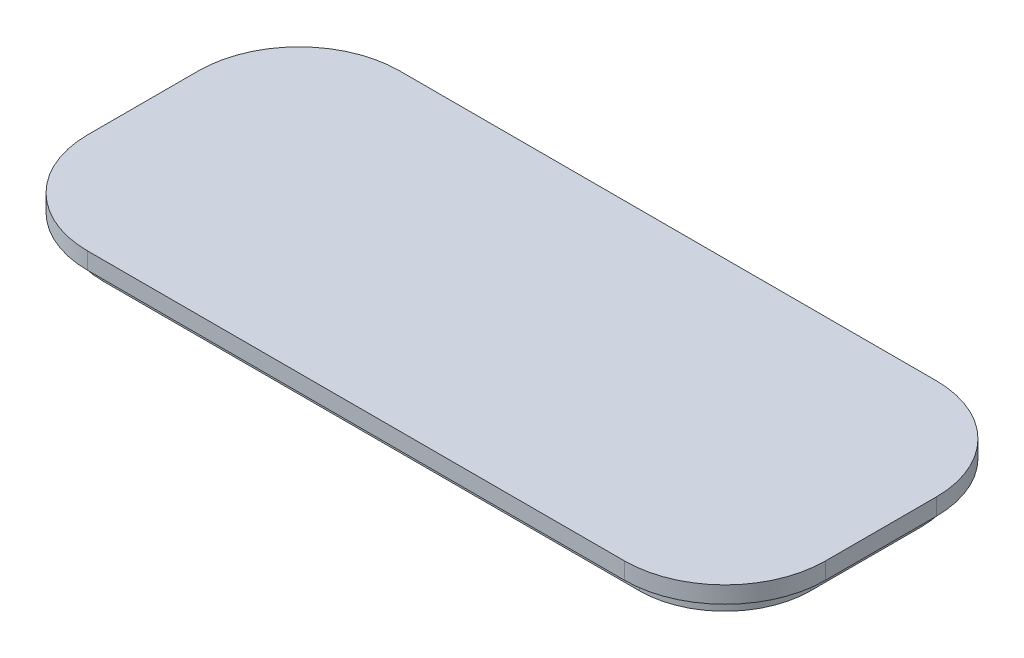
ISO-10303-21;
HEADER;
FILE_DESCRIPTION(('STEP AP214'),'2;1');
FILE_NAME('part.step','',(''),(''),'','','');
FILE_SCHEMA(('AUTOMOTIVE_DESIGN { 1 0 10303 214 1 1 1 1 }'));
ENDSEC;
DATA;
#1=APPLICATION_CONTEXT('core data for automotive mechanical design processes');
#2=APPLICATION_PROTOCOL_DEFINITION('international standard','automotive_design',2000,#1);
#3=PRODUCT_CONTEXT('',#1,'mechanical');
#4=PRODUCT('Part','Part','',(#3));
#5=PRODUCT_RELATED_PRODUCT_CATEGORY('part','',(#4));
#6=PRODUCT_DEFINITION_FORMATION('','',#4);
#7=PRODUCT_DEFINITION_CONTEXT('part definition',#1,'design');
#8=PRODUCT_DEFINITION('design','',#6,#7);
#9=PRODUCT_DEFINITION_SHAPE('','',#8);
#10=(LENGTH_UNIT() NAMED_UNIT(*) SI_UNIT(.MILLI.,.METRE.));
#11=(NAMED_UNIT(*) PLANE_ANGLE_UNIT() SI_UNIT($,.RADIAN.));
#12=(NAMED_UNIT(*) SI_UNIT($,.STERADIAN.) SOLID_ANGLE_UNIT());
#13=UNCERTAINTY_MEASURE_WITH_UNIT(LENGTH_MEASURE(1.E-05),#10,'distance_accuracy_value','');
#14=(GEOMETRIC_REPRESENTATION_CONTEXT(3) GLOBAL_UNCERTAINTY_ASSIGNED_CONTEXT((#13)) GLOBAL_UNIT_ASSIGNED_CONTEXT((#10,
#11,#12)) REPRESENTATION_CONTEXT('',''));
#15=CARTESIAN_POINT('',(0.,0.,0.));
#16=DIRECTION('',(0.,0.,1.));
#17=DIRECTION('',(1.,0.,0.));
#18=AXIS2_PLACEMENT_3D('',#15,#16,#17);
#19=CARTESIAN_POINT('',(0.,0.,0.));
#20=DIRECTION('',(0.,1.,0.));
#21=DIRECTION('',(0.,0.,1.));
#22=AXIS2_PLACEMENT_3D('',#19,#20,#21);
#23=PLANE('',#22);
#24=DIRECTION('',(-1.,0.,0.));
#25=VECTOR('',#24,1.);
#26=CARTESIAN_POINT('',(-110.,0.,-46.5));
#27=LINE('',#26,#25);
#28=CARTESIAN_POINT('',(80.,0.,-46.5));
#29=VERTEX_POINT('',#28);
#30=CARTESIAN_POINT('',(-80.,0.,-46.5));
#31=VERTEX_POINT('',#30);
#32=EDGE_CURVE('E399',#29,#31,#27,.T.);
#33=ORIENTED_EDGE('',*,*,#32,.F.);
#34=CARTESIAN_POINT('',(80.,0.,-16.5));
#35=DIRECTION('',(0.,1.,0.));
#36=DIRECTION('',(0.,0.,1.));
#37=AXIS2_PLACEMENT_3D('',#34,#35,#36);
#38=CIRCLE('',#37,30.);
#39=CARTESIAN_POINT('',(110.,0.,-16.5));
#40=VERTEX_POINT('',#39);
#41=EDGE_CURVE('E425',#29,#40,#38,.F.);
#42=ORIENTED_EDGE('',*,*,#41,.T.);
#43=DIRECTION('',(0.,0.,-1.));
#44=VECTOR('',#43,1.);
#45=CARTESIAN_POINT('',(110.,0.,-46.5));
#46=LINE('',#45,#44);
#47=CARTESIAN_POINT('',(110.,0.,16.5));
#48=VERTEX_POINT('',#47);
#49=EDGE_CURVE('E377',#48,#40,#46,.T.);
#50=ORIENTED_EDGE('',*,*,#49,.F.);
#51=CARTESIAN_POINT('',(80.,0.,16.5));
#52=DIRECTION('',(0.,1.,0.));
#53=DIRECTION('',(0.,0.,1.));
#54=AXIS2_PLACEMENT_3D('',#51,#52,#53);
#55=CIRCLE('',#54,30.);
#56=CARTESIAN_POINT('',(80.,0.,46.5));
#57=VERTEX_POINT('',#56);
#58=EDGE_CURVE('E422',#48,#57,#55,.F.);
#59=ORIENTED_EDGE('',*,*,#58,.T.);
#60=DIRECTION('',(1.,0.,0.));
#61=VECTOR('',#60,1.);
#62=CARTESIAN_POINT('',(-110.,0.,46.5));
#63=LINE('',#62,#61);
#64=CARTESIAN_POINT('',(-80.,0.,46.5));
#65=VERTEX_POINT('',#64);
#66=EDGE_CURVE('E383',#65,#57,#63,.T.);
#67=ORIENTED_EDGE('',*,*,#66,.F.);
#68=CARTESIAN_POINT('',(-80.,0.,16.5));
#69=DIRECTION('',(0.,1.,0.));
#70=DIRECTION('',(0.,0.,1.));
#71=AXIS2_PLACEMENT_3D('',#68,#69,#70);
#72=CIRCLE('',#71,30.);
#73=CARTESIAN_POINT('',(-110.,0.,16.5));
#74=VERTEX_POINT('',#73);
#75=EDGE_CURVE('E419',#65,#74,#72,.F.);
#76=ORIENTED_EDGE('',*,*,#75,.T.);
#77=DIRECTION('',(0.,0.,1.));
#78=VECTOR('',#77,1.);
#79=CARTESIAN_POINT('',(-110.,0.,-46.5));
#80=LINE('',#79,#78);
#81=CARTESIAN_POINT('',(-110.,0.,-16.5));
#82=VERTEX_POINT('',#81);
#83=EDGE_CURVE('E403',#82,#74,#80,.T.);
#84=ORIENTED_EDGE('',*,*,#83,.F.);
#85=CARTESIAN_POINT('',(-80.,0.,-16.5));
#86=DIRECTION('',(0.,1.,0.));
#87=DIRECTION('',(0.,0.,1.));
#88=AXIS2_PLACEMENT_3D('',#85,#86,#87);
#89=CIRCLE('',#88,30.);
#90=EDGE_CURVE('E416',#82,#31,#89,.F.);
#91=ORIENTED_EDGE('',*,*,#90,.T.);
#92=EDGE_LOOP('',(#33,#42,#50,#59,#67,#76,#84,#91));
#93=FACE_BOUND('',#92,.T.);
#94=CARTESIAN_POINT('',(-80.,0.,-16.5));
#95=DIRECTION('',(0.,-1.,0.));
#96=DIRECTION('',(0.,0.,-1.));
#97=AXIS2_PLACEMENT_3D('',#94,#95,#96);
#98=CIRCLE('',#97,25.5);
#99=CARTESIAN_POINT('',(-105.5,0.,-16.5));
#100=VERTEX_POINT('',#99);
#101=CARTESIAN_POINT('',(-80.,0.,-42.));
#102=VERTEX_POINT('',#101);
#103=EDGE_CURVE('E219',#100,#102,#98,.T.);
#104=ORIENTED_EDGE('',*,*,#103,.F.);
#105=DIRECTION('',(0.,0.,-1.));
#106=VECTOR('',#105,1.);
#107=CARTESIAN_POINT('',(-105.5,0.,16.5));
#108=LINE('',#107,#106);
#109=CARTESIAN_POINT('',(-105.5,0.,16.5));
#110=VERTEX_POINT('',#109);
#111=EDGE_CURVE('E299',#110,#100,#108,.T.);
#112=ORIENTED_EDGE('',*,*,#111,.F.);
#113=CARTESIAN_POINT('',(-80.,0.,16.5));
#114=DIRECTION('',(0.,-1.,0.));
#115=DIRECTION('',(0.,0.,-1.));
#116=AXIS2_PLACEMENT_3D('',#113,#114,#115);
#117=CIRCLE('',#116,25.5);
#118=CARTESIAN_POINT('',(-80.,0.,42.));
#119=VERTEX_POINT('',#118);
#120=EDGE_CURVE('E340',#119,#110,#117,.T.);
#121=ORIENTED_EDGE('',*,*,#120,.F.);
#122=DIRECTION('',(-1.,0.,0.));
#123=VECTOR('',#122,1.);
#124=CARTESIAN_POINT('',(80.,0.,42.));
#125=LINE('',#124,#123);
#126=CARTESIAN_POINT('',(80.,0.,42.));
#127=VERTEX_POINT('',#126);
#128=EDGE_CURVE('E336',#127,#119,#125,.T.);
#129=ORIENTED_EDGE('',*,*,#128,.F.);
#130=CARTESIAN_POINT('',(80.,0.,16.5));
#131=DIRECTION('',(0.,-1.,0.));
#132=DIRECTION('',(0.,0.,-1.));
#133=AXIS2_PLACEMENT_3D('',#130,#131,#132);
#134=CIRCLE('',#133,25.5);
#135=CARTESIAN_POINT('',(105.5,0.,16.5));
#136=VERTEX_POINT('',#135);
#137=EDGE_CURVE('E332',#136,#127,#134,.T.);
#138=ORIENTED_EDGE('',*,*,#137,.F.);
#139=DIRECTION('',(0.,0.,1.));
#140=VECTOR('',#139,1.);
#141=CARTESIAN_POINT('',(105.5,0.,-16.5));
#142=LINE('',#141,#140);
#143=CARTESIAN_POINT('',(105.5,0.,-16.5));
#144=VERTEX_POINT('',#143);
#145=EDGE_CURVE('E328',#144,#136,#142,.T.);
#146=ORIENTED_EDGE('',*,*,#145,.F.);
#147=CARTESIAN_POINT('',(80.,0.,-16.5));
#148=DIRECTION('',(0.,-1.,0.));
#149=DIRECTION('',(0.,0.,-1.));
#150=AXIS2_PLACEMENT_3D('',#147,#148,#149);
#151=CIRCLE('',#150,25.5);
#152=CARTESIAN_POINT('',(80.,0.,-42.));
#153=VERTEX_POINT('',#152);
#154=EDGE_CURVE('E60',#153,#144,#151,.T.);
#155=ORIENTED_EDGE('',*,*,#154,.F.);
#156=DIRECTION('',(1.,0.,0.));
#157=VECTOR('',#156,1.);
#158=CARTESIAN_POINT('',(-80.,0.,-42.));
#159=LINE('',#158,#157);
#160=EDGE_CURVE('E55',#102,#153,#159,.T.);
#161=ORIENTED_EDGE('',*,*,#160,.F.);
#162=EDGE_LOOP('',(#104,#112,#121,#129,#138,#146,#155,#161));
#163=FACE_BOUND('',#162,.T.);
#164=ADVANCED_FACE('F39',(#93,#163),#23,.F.);
#165=CARTESIAN_POINT('',(110.,5.,-46.5));
#166=DIRECTION('',(-1.,0.,0.));
#167=DIRECTION('',(0.,0.,1.));
#168=AXIS2_PLACEMENT_3D('',#165,#166,#167);
#169=PLANE('',#168);
#170=ORIENTED_EDGE('',*,*,#49,.T.);
#171=DIRECTION('',(0.,-1.,0.));
#172=VECTOR('',#171,1.);
#173=CARTESIAN_POINT('',(110.,5.,-16.5));
#174=LINE('',#173,#172);
#175=CARTESIAN_POINT('',(110.,5.,-16.5));
#176=VERTEX_POINT('',#175);
#177=EDGE_CURVE('E432',#40,#176,#174,.F.);
#178=ORIENTED_EDGE('',*,*,#177,.T.);
#179=DIRECTION('',(0.,0.,-1.));
#180=VECTOR('',#179,1.);
#181=CARTESIAN_POINT('',(110.,5.,-46.5));
#182=LINE('',#181,#180);
#183=CARTESIAN_POINT('',(110.,5.,16.5));
#184=VERTEX_POINT('',#183);
#185=EDGE_CURVE('E378',#184,#176,#182,.T.);
#186=ORIENTED_EDGE('',*,*,#185,.F.);
#187=DIRECTION('',(0.,-1.,0.));
#188=VECTOR('',#187,1.);
#189=CARTESIAN_POINT('',(110.,5.,16.5));
#190=LINE('',#189,#188);
#191=EDGE_CURVE('E428',#184,#48,#190,.T.);
#192=ORIENTED_EDGE('',*,*,#191,.T.);
#193=EDGE_LOOP('',(#170,#178,#186,#192));
#194=FACE_BOUND('',#193,.T.);
#195=ADVANCED_FACE('F483',(#194),#169,.F.);
#196=CARTESIAN_POINT('',(-110.,5.,-46.5));
#197=DIRECTION('',(0.,0.,1.));
#198=DIRECTION('',(1.,0.,0.));
#199=AXIS2_PLACEMENT_3D('',#196,#197,#198);
#200=PLANE('',#199);
#201=DIRECTION('',(-1.,0.,0.));
#202=VECTOR('',#201,1.);
#203=CARTESIAN_POINT('',(-110.,5.,-46.5));
#204=LINE('',#203,#202);
#205=CARTESIAN_POINT('',(80.,5.,-46.5));
#206=VERTEX_POINT('',#205);
#207=CARTESIAN_POINT('',(-80.,5.,-46.5));
#208=VERTEX_POINT('',#207);
#209=EDGE_CURVE('E382',#206,#208,#204,.T.);
#210=ORIENTED_EDGE('',*,*,#209,.F.);
#211=DIRECTION('',(0.,-1.,0.));
#212=VECTOR('',#211,1.);
#213=CARTESIAN_POINT('',(80.,5.,-46.5));
#214=LINE('',#213,#212);
#215=EDGE_CURVE('E412',#206,#29,#214,.T.);
#216=ORIENTED_EDGE('',*,*,#215,.T.);
#217=ORIENTED_EDGE('',*,*,#32,.T.);
#218=DIRECTION('',(0.,-1.,0.));
#219=VECTOR('',#218,1.);
#220=CARTESIAN_POINT('',(-80.,5.,-46.5));
#221=LINE('',#220,#219);
#222=EDGE_CURVE('E395',#31,#208,#221,.F.);
#223=ORIENTED_EDGE('',*,*,#222,.T.);
#224=EDGE_LOOP('',(#210,#216,#217,#223));
#225=FACE_BOUND('',#224,.T.);
#226=ADVANCED_FACE('F491',(#225),#200,.F.);
#227=CARTESIAN_POINT('',(-110.,5.,-46.5));
#228=DIRECTION('',(1.,0.,0.));
#229=DIRECTION('',(0.,0.,-1.));
#230=AXIS2_PLACEMENT_3D('',#227,#228,#229);
#231=PLANE('',#230);
#232=ORIENTED_EDGE('',*,*,#83,.T.);
#233=DIRECTION('',(0.,-1.,0.));
#234=VECTOR('',#233,1.);
#235=CARTESIAN_POINT('',(-110.,5.,16.5));
#236=LINE('',#235,#234);
#237=CARTESIAN_POINT('',(-110.,5.,16.5));
#238=VERTEX_POINT('',#237);
#239=EDGE_CURVE('E11',#74,#238,#236,.F.);
#240=ORIENTED_EDGE('',*,*,#239,.T.);
#241=DIRECTION('',(0.,0.,1.));
#242=VECTOR('',#241,1.);
#243=CARTESIAN_POINT('',(-110.,5.,-46.5));
#244=LINE('',#243,#242);
#245=CARTESIAN_POINT('',(-110.,5.,-16.5));
#246=VERTEX_POINT('',#245);
#247=EDGE_CURVE('E387',#246,#238,#244,.T.);
#248=ORIENTED_EDGE('',*,*,#247,.F.);
#249=DIRECTION('',(0.,-1.,0.));
#250=VECTOR('',#249,1.);
#251=CARTESIAN_POINT('',(-110.,5.,-16.5));
#252=LINE('',#251,#250);
#253=EDGE_CURVE('E48',#246,#82,#252,.T.);
#254=ORIENTED_EDGE('',*,*,#253,.T.);
#255=EDGE_LOOP('',(#232,#240,#248,#254));
#256=FACE_BOUND('',#255,.T.);
#257=ADVANCED_FACE('F459',(#256),#231,.F.);
#258=CARTESIAN_POINT('',(-110.,5.,46.5));
#259=DIRECTION('',(0.,0.,-1.));
#260=DIRECTION('',(-1.,0.,0.));
#261=AXIS2_PLACEMENT_3D('',#258,#259,#260);
#262=PLANE('',#261);
#263=ORIENTED_EDGE('',*,*,#66,.T.);
#264=DIRECTION('',(0.,-1.,0.));
#265=VECTOR('',#264,1.);
#266=CARTESIAN_POINT('',(80.,5.,46.5));
#267=LINE('',#266,#265);
#268=CARTESIAN_POINT('',(80.,5.,46.5));
#269=VERTEX_POINT('',#268);
#270=EDGE_CURVE('E451',#57,#269,#267,.F.);
#271=ORIENTED_EDGE('',*,*,#270,.T.);
#272=DIRECTION('',(1.,0.,0.));
#273=VECTOR('',#272,1.);
#274=CARTESIAN_POINT('',(-110.,5.,46.5));
#275=LINE('',#274,#273);
#276=CARTESIAN_POINT('',(-80.,5.,46.5));
#277=VERTEX_POINT('',#276);
#278=EDGE_CURVE('E391',#277,#269,#275,.T.);
#279=ORIENTED_EDGE('',*,*,#278,.F.);
#280=DIRECTION('',(0.,-1.,0.));
#281=VECTOR('',#280,1.);
#282=CARTESIAN_POINT('',(-80.,5.,46.5));
#283=LINE('',#282,#281);
#284=EDGE_CURVE('E447',#277,#65,#283,.T.);
#285=ORIENTED_EDGE('',*,*,#284,.T.);
#286=EDGE_LOOP('',(#263,#271,#279,#285));
#287=FACE_BOUND('',#286,.T.);
#288=ADVANCED_FACE('F472',(#287),#262,.F.);
#289=CARTESIAN_POINT('',(0.,5.,0.));
#290=DIRECTION('',(0.,1.,0.));
#291=DIRECTION('',(0.,0.,1.));
#292=AXIS2_PLACEMENT_3D('',#289,#290,#291);
#293=PLANE('',#292);
#294=ORIENTED_EDGE('',*,*,#185,.T.);
#295=CARTESIAN_POINT('',(80.,5.,-16.5));
#296=DIRECTION('',(0.,1.,0.));
#297=DIRECTION('',(0.,0.,1.));
#298=AXIS2_PLACEMENT_3D('',#295,#296,#297);
#299=CIRCLE('',#298,30.);
#300=EDGE_CURVE('E444',#176,#206,#299,.T.);
#301=ORIENTED_EDGE('',*,*,#300,.T.);
#302=ORIENTED_EDGE('',*,*,#209,.T.);
#303=CARTESIAN_POINT('',(-80.,5.,-16.5));
#304=DIRECTION('',(0.,1.,0.));
#305=DIRECTION('',(0.,0.,1.));
#306=AXIS2_PLACEMENT_3D('',#303,#304,#305);
#307=CIRCLE('',#306,30.);
#308=EDGE_CURVE('E435',#208,#246,#307,.T.);
#309=ORIENTED_EDGE('',*,*,#308,.T.);
#310=ORIENTED_EDGE('',*,*,#247,.T.);
#311=CARTESIAN_POINT('',(-80.,5.,16.5));
#312=DIRECTION('',(0.,1.,0.));
#313=DIRECTION('',(0.,0.,1.));
#314=AXIS2_PLACEMENT_3D('',#311,#312,#313);
#315=CIRCLE('',#314,30.);
#316=EDGE_CURVE('E438',#238,#277,#315,.T.);
#317=ORIENTED_EDGE('',*,*,#316,.T.);
#318=ORIENTED_EDGE('',*,*,#278,.T.);
#319=CARTESIAN_POINT('',(80.,5.,16.5));
#320=DIRECTION('',(0.,1.,0.));
#321=DIRECTION('',(0.,0.,1.));
#322=AXIS2_PLACEMENT_3D('',#319,#320,#321);
#323=CIRCLE('',#322,30.);
#324=EDGE_CURVE('E441',#269,#184,#323,.T.);
#325=ORIENTED_EDGE('',*,*,#324,.T.);
#326=EDGE_LOOP('',(#294,#301,#302,#309,#310,#317,#318,#325));
#327=FACE_BOUND('',#326,.T.);
#328=ADVANCED_FACE('F476',(#327),#293,.T.);
#329=CARTESIAN_POINT('',(80.,5.,-16.5));
#330=DIRECTION('',(0.,-1.,0.));
#331=DIRECTION('',(0.,0.,-1.));
#332=AXIS2_PLACEMENT_3D('',#329,#330,#331);
#333=CYLINDRICAL_SURFACE('',#332,30.);
#334=ORIENTED_EDGE('',*,*,#300,.F.);
#335=ORIENTED_EDGE('',*,*,#177,.F.);
#336=ORIENTED_EDGE('',*,*,#41,.F.);
#337=ORIENTED_EDGE('',*,*,#215,.F.);
#338=EDGE_LOOP('',(#334,#335,#336,#337));
#339=FACE_BOUND('',#338,.T.);
#340=ADVANCED_FACE('F488',(#339),#333,.T.);
#341=CARTESIAN_POINT('',(80.,5.,16.5));
#342=DIRECTION('',(0.,-1.,0.));
#343=DIRECTION('',(0.,0.,-1.));
#344=AXIS2_PLACEMENT_3D('',#341,#342,#343);
#345=CYLINDRICAL_SURFACE('',#344,30.);
#346=ORIENTED_EDGE('',*,*,#324,.F.);
#347=ORIENTED_EDGE('',*,*,#270,.F.);
#348=ORIENTED_EDGE('',*,*,#58,.F.);
#349=ORIENTED_EDGE('',*,*,#191,.F.);
#350=EDGE_LOOP('',(#346,#347,#348,#349));
#351=FACE_BOUND('',#350,.T.);
#352=ADVANCED_FACE('F480',(#351),#345,.T.);
#353=CARTESIAN_POINT('',(-80.,5.,16.5));
#354=DIRECTION('',(0.,-1.,0.));
#355=DIRECTION('',(0.,0.,-1.));
#356=AXIS2_PLACEMENT_3D('',#353,#354,#355);
#357=CYLINDRICAL_SURFACE('',#356,30.);
#358=ORIENTED_EDGE('',*,*,#316,.F.);
#359=ORIENTED_EDGE('',*,*,#239,.F.);
#360=ORIENTED_EDGE('',*,*,#75,.F.);
#361=ORIENTED_EDGE('',*,*,#284,.F.);
#362=EDGE_LOOP('',(#358,#359,#360,#361));
#363=FACE_BOUND('',#362,.T.);
#364=ADVANCED_FACE('F469',(#363),#357,.T.);
#365=CARTESIAN_POINT('',(-80.,5.,-16.5));
#366=DIRECTION('',(0.,-1.,0.));
#367=DIRECTION('',(0.,0.,-1.));
#368=AXIS2_PLACEMENT_3D('',#365,#366,#367);
#369=CYLINDRICAL_SURFACE('',#368,30.);
#370=ORIENTED_EDGE('',*,*,#308,.F.);
#371=ORIENTED_EDGE('',*,*,#222,.F.);
#372=ORIENTED_EDGE('',*,*,#90,.F.);
#373=ORIENTED_EDGE('',*,*,#253,.F.);
#374=EDGE_LOOP('',(#370,#371,#372,#373));
#375=FACE_BOUND('',#374,.T.);
#376=ADVANCED_FACE('F41',(#375),#369,.T.);
#377=CARTESIAN_POINT('',(-80.,-5.,-16.5));
#378=DIRECTION('',(0.,-1.,0.));
#379=DIRECTION('',(0.,0.,-1.));
#380=AXIS2_PLACEMENT_3D('',#377,#378,#379);
#381=PLANE('',#380);
#382=CARTESIAN_POINT('',(-80.,-5.,-16.5));
#383=DIRECTION('',(0.,-1.,0.));
#384=DIRECTION('',(0.,0.,-1.));
#385=AXIS2_PLACEMENT_3D('',#382,#383,#384);
#386=CIRCLE('',#385,25.5);
#387=CARTESIAN_POINT('',(-105.5,-5.,-16.5));
#388=VERTEX_POINT('',#387);
#389=CARTESIAN_POINT('',(-80.,-5.,-42.));
#390=VERTEX_POINT('',#389);
#391=EDGE_CURVE('E294',#388,#390,#386,.T.);
#392=ORIENTED_EDGE('',*,*,#391,.T.);
#393=DIRECTION('',(1.,0.,0.));
#394=VECTOR('',#393,1.);
#395=CARTESIAN_POINT('',(-80.,-5.,-42.));
#396=LINE('',#395,#394);
#397=CARTESIAN_POINT('',(80.,-5.,-42.));
#398=VERTEX_POINT('',#397);
#399=EDGE_CURVE('E298',#390,#398,#396,.T.);
#400=ORIENTED_EDGE('',*,*,#399,.T.);
#401=CARTESIAN_POINT('',(80.,-5.,-16.5));
#402=DIRECTION('',(0.,-1.,0.));
#403=DIRECTION('',(0.,0.,-1.));
#404=AXIS2_PLACEMENT_3D('',#401,#402,#403);
#405=CIRCLE('',#404,25.5);
#406=CARTESIAN_POINT('',(105.5,-5.,-16.5));
#407=VERTEX_POINT('',#406);
#408=EDGE_CURVE('E302',#398,#407,#405,.T.);
#409=ORIENTED_EDGE('',*,*,#408,.T.);
#410=DIRECTION('',(0.,0.,1.));
#411=VECTOR('',#410,1.);
#412=CARTESIAN_POINT('',(105.5,-5.,-16.5));
#413=LINE('',#412,#411);
#414=CARTESIAN_POINT('',(105.5,-5.,16.5));
#415=VERTEX_POINT('',#414);
#416=EDGE_CURVE('E305',#407,#415,#413,.T.);
#417=ORIENTED_EDGE('',*,*,#416,.T.);
#418=CARTESIAN_POINT('',(80.,-5.,16.5));
#419=DIRECTION('',(0.,-1.,0.));
#420=DIRECTION('',(0.,0.,-1.));
#421=AXIS2_PLACEMENT_3D('',#418,#419,#420);
#422=CIRCLE('',#421,25.5);
#423=CARTESIAN_POINT('',(80.,-5.,42.));
#424=VERTEX_POINT('',#423);
#425=EDGE_CURVE('E308',#415,#424,#422,.T.);
#426=ORIENTED_EDGE('',*,*,#425,.T.);
#427=DIRECTION('',(-1.,0.,0.));
#428=VECTOR('',#427,1.);
#429=CARTESIAN_POINT('',(80.,-5.,42.));
#430=LINE('',#429,#428);
#431=CARTESIAN_POINT('',(-80.,-5.,42.));
#432=VERTEX_POINT('',#431);
#433=EDGE_CURVE('E311',#424,#432,#430,.T.);
#434=ORIENTED_EDGE('',*,*,#433,.T.);
#435=CARTESIAN_POINT('',(-80.,-5.,16.5));
#436=DIRECTION('',(0.,-1.,0.));
#437=DIRECTION('',(0.,0.,-1.));
#438=AXIS2_PLACEMENT_3D('',#435,#436,#437);
#439=CIRCLE('',#438,25.5);
#440=CARTESIAN_POINT('',(-105.5,-5.,16.5));
#441=VERTEX_POINT('',#440);
#442=EDGE_CURVE('E314',#432,#441,#439,.T.);
#443=ORIENTED_EDGE('',*,*,#442,.T.);
#444=DIRECTION('',(0.,0.,-1.));
#445=VECTOR('',#444,1.);
#446=CARTESIAN_POINT('',(-105.5,-5.,16.5));
#447=LINE('',#446,#445);
#448=EDGE_CURVE('E317',#441,#388,#447,.T.);
#449=ORIENTED_EDGE('',*,*,#448,.T.);
#450=EDGE_LOOP('',(#392,#400,#409,#417,#426,#434,#443,#449));
#451=FACE_BOUND('',#450,.T.);
#452=DIRECTION('',(1.,0.,0.));
#453=VECTOR('',#452,1.);
#454=CARTESIAN_POINT('',(-80.,-5.,-36.5));
#455=LINE('',#454,#453);
#456=CARTESIAN_POINT('',(-80.,-5.,-36.5));
#457=VERTEX_POINT('',#456);
#458=CARTESIAN_POINT('',(80.,-5.,-36.5));
#459=VERTEX_POINT('',#458);
#460=EDGE_CURVE('E210',#457,#459,#455,.T.);
#461=ORIENTED_EDGE('',*,*,#460,.F.);
#462=CARTESIAN_POINT('',(-80.,-5.,-16.5));
#463=DIRECTION('',(0.,-1.,0.));
#464=DIRECTION('',(0.,0.,-1.));
#465=AXIS2_PLACEMENT_3D('',#462,#463,#464);
#466=CIRCLE('',#465,20.);
#467=CARTESIAN_POINT('',(-100.,-5.,-16.5));
#468=VERTEX_POINT('',#467);
#469=EDGE_CURVE('E199',#468,#457,#466,.T.);
#470=ORIENTED_EDGE('',*,*,#469,.F.);
#471=DIRECTION('',(0.,0.,-1.));
#472=VECTOR('',#471,1.);
#473=CARTESIAN_POINT('',(-100.,-5.,16.5));
#474=LINE('',#473,#472);
#475=CARTESIAN_POINT('',(-100.,-5.,16.5));
#476=VERTEX_POINT('',#475);
#477=EDGE_CURVE('E244',#476,#468,#474,.T.);
#478=ORIENTED_EDGE('',*,*,#477,.F.);
#479=CARTESIAN_POINT('',(-80.,-5.,16.5));
#480=DIRECTION('',(0.,-1.,0.));
#481=DIRECTION('',(0.,0.,-1.));
#482=AXIS2_PLACEMENT_3D('',#479,#480,#481);
#483=CIRCLE('',#482,20.);
#484=CARTESIAN_POINT('',(-80.,-5.,36.5));
#485=VERTEX_POINT('',#484);
#486=EDGE_CURVE('E240',#485,#476,#483,.T.);
#487=ORIENTED_EDGE('',*,*,#486,.F.);
#488=DIRECTION('',(-1.,0.,0.));
#489=VECTOR('',#488,1.);
#490=CARTESIAN_POINT('',(80.,-5.,36.5));
#491=LINE('',#490,#489);
#492=CARTESIAN_POINT('',(80.,-5.,36.5));
#493=VERTEX_POINT('',#492);
#494=EDGE_CURVE('E237',#493,#485,#491,.T.);
#495=ORIENTED_EDGE('',*,*,#494,.F.);
#496=CARTESIAN_POINT('',(80.,-5.,16.5));
#497=DIRECTION('',(0.,-1.,0.));
#498=DIRECTION('',(0.,0.,-1.));
#499=AXIS2_PLACEMENT_3D('',#496,#497,#498);
#500=CIRCLE('',#499,20.);
#501=CARTESIAN_POINT('',(100.,-5.,16.5));
#502=VERTEX_POINT('',#501);
#503=EDGE_CURVE('E234',#502,#493,#500,.T.);
#504=ORIENTED_EDGE('',*,*,#503,.F.);
#505=DIRECTION('',(0.,0.,1.));
#506=VECTOR('',#505,1.);
#507=CARTESIAN_POINT('',(100.,-5.,-16.5));
#508=LINE('',#507,#506);
#509=CARTESIAN_POINT('',(100.,-5.,-16.5));
#510=VERTEX_POINT('',#509);
#511=EDGE_CURVE('E229',#510,#502,#508,.T.);
#512=ORIENTED_EDGE('',*,*,#511,.F.);
#513=CARTESIAN_POINT('',(80.,-5.,-16.5));
#514=DIRECTION('',(0.,-1.,0.));
#515=DIRECTION('',(0.,0.,-1.));
#516=AXIS2_PLACEMENT_3D('',#513,#514,#515);
#517=CIRCLE('',#516,20.);
#518=EDGE_CURVE('E225',#459,#510,#517,.T.);
#519=ORIENTED_EDGE('',*,*,#518,.F.);
#520=EDGE_LOOP('',(#461,#470,#478,#487,#495,#504,#512,#519));
#521=FACE_BOUND('',#520,.T.);
#522=ADVANCED_FACE('F223',(#451,#521),#381,.T.);
#523=CARTESIAN_POINT('',(-80.,-5.,-16.5));
#524=DIRECTION('',(0.,1.,0.));
#525=DIRECTION('',(0.,0.,1.));
#526=AXIS2_PLACEMENT_3D('',#523,#524,#525);
#527=CYLINDRICAL_SURFACE('',#526,25.5);
#528=ORIENTED_EDGE('',*,*,#103,.T.);
#529=DIRECTION('',(0.,1.,0.));
#530=VECTOR('',#529,1.);
#531=CARTESIAN_POINT('',(-80.,-5.,-42.));
#532=LINE('',#531,#530);
#533=EDGE_CURVE('E374',#390,#102,#532,.T.);
#534=ORIENTED_EDGE('',*,*,#533,.F.);
#535=ORIENTED_EDGE('',*,*,#391,.F.);
#536=DIRECTION('',(0.,1.,0.));
#537=VECTOR('',#536,1.);
#538=CARTESIAN_POINT('',(-105.5,-5.,-16.5));
#539=LINE('',#538,#537);
#540=EDGE_CURVE('E320',#388,#100,#539,.T.);
#541=ORIENTED_EDGE('',*,*,#540,.T.);
#542=EDGE_LOOP('',(#528,#534,#535,#541));
#543=FACE_BOUND('',#542,.T.);
#544=ADVANCED_FACE('F498',(#543),#527,.T.);
#545=CARTESIAN_POINT('',(-80.,-5.,-42.));
#546=DIRECTION('',(0.,0.,1.));
#547=DIRECTION('',(1.,0.,0.));
#548=AXIS2_PLACEMENT_3D('',#545,#546,#547);
#549=PLANE('',#548);
#550=ORIENTED_EDGE('',*,*,#160,.T.);
#551=DIRECTION('',(0.,1.,0.));
#552=VECTOR('',#551,1.);
#553=CARTESIAN_POINT('',(80.,-5.,-42.));
#554=LINE('',#553,#552);
#555=EDGE_CURVE('E370',#398,#153,#554,.T.);
#556=ORIENTED_EDGE('',*,*,#555,.F.);
#557=ORIENTED_EDGE('',*,*,#399,.F.);
#558=ORIENTED_EDGE('',*,*,#533,.T.);
#559=EDGE_LOOP('',(#550,#556,#557,#558));
#560=FACE_BOUND('',#559,.T.);
#561=ADVANCED_FACE('F576',(#560),#549,.F.);
#562=CARTESIAN_POINT('',(80.,-5.,-16.5));
#563=DIRECTION('',(0.,1.,0.));
#564=DIRECTION('',(0.,0.,1.));
#565=AXIS2_PLACEMENT_3D('',#562,#563,#564);
#566=CYLINDRICAL_SURFACE('',#565,25.5);
#567=ORIENTED_EDGE('',*,*,#154,.T.);
#568=DIRECTION('',(0.,1.,0.));
#569=VECTOR('',#568,1.);
#570=CARTESIAN_POINT('',(105.5,-5.,-16.5));
#571=LINE('',#570,#569);
#572=EDGE_CURVE('E366',#407,#144,#571,.T.);
#573=ORIENTED_EDGE('',*,*,#572,.F.);
#574=ORIENTED_EDGE('',*,*,#408,.F.);
#575=ORIENTED_EDGE('',*,*,#555,.T.);
#576=EDGE_LOOP('',(#567,#573,#574,#575));
#577=FACE_BOUND('',#576,.T.);
#578=ADVANCED_FACE('F572',(#577),#566,.T.);
#579=CARTESIAN_POINT('',(105.5,-5.,-16.5));
#580=DIRECTION('',(-1.,0.,0.));
#581=DIRECTION('',(0.,0.,1.));
#582=AXIS2_PLACEMENT_3D('',#579,#580,#581);
#583=PLANE('',#582);
#584=ORIENTED_EDGE('',*,*,#145,.T.);
#585=DIRECTION('',(0.,1.,0.));
#586=VECTOR('',#585,1.);
#587=CARTESIAN_POINT('',(105.5,-5.,16.5));
#588=LINE('',#587,#586);
#589=EDGE_CURVE('E362',#415,#136,#588,.T.);
#590=ORIENTED_EDGE('',*,*,#589,.F.);
#591=ORIENTED_EDGE('',*,*,#416,.F.);
#592=ORIENTED_EDGE('',*,*,#572,.T.);
#593=EDGE_LOOP('',(#584,#590,#591,#592));
#594=FACE_BOUND('',#593,.T.);
#595=ADVANCED_FACE('F568',(#594),#583,.F.);
#596=CARTESIAN_POINT('',(80.,-5.,16.5));
#597=DIRECTION('',(0.,1.,0.));
#598=DIRECTION('',(0.,0.,1.));
#599=AXIS2_PLACEMENT_3D('',#596,#597,#598);
#600=CYLINDRICAL_SURFACE('',#599,25.5);
#601=ORIENTED_EDGE('',*,*,#137,.T.);
#602=DIRECTION('',(0.,1.,0.));
#603=VECTOR('',#602,1.);
#604=CARTESIAN_POINT('',(80.,-5.,42.));
#605=LINE('',#604,#603);
#606=EDGE_CURVE('E358',#424,#127,#605,.T.);
#607=ORIENTED_EDGE('',*,*,#606,.F.);
#608=ORIENTED_EDGE('',*,*,#425,.F.);
#609=ORIENTED_EDGE('',*,*,#589,.T.);
#610=EDGE_LOOP('',(#601,#607,#608,#609));
#611=FACE_BOUND('',#610,.T.);
#612=ADVANCED_FACE('F564',(#611),#600,.T.);
#613=CARTESIAN_POINT('',(80.,-5.,42.));
#614=DIRECTION('',(0.,0.,-1.));
#615=DIRECTION('',(-1.,0.,0.));
#616=AXIS2_PLACEMENT_3D('',#613,#614,#615);
#617=PLANE('',#616);
#618=ORIENTED_EDGE('',*,*,#128,.T.);
#619=DIRECTION('',(0.,1.,0.));
#620=VECTOR('',#619,1.);
#621=CARTESIAN_POINT('',(-80.,-5.,42.));
#622=LINE('',#621,#620);
#623=EDGE_CURVE('E354',#432,#119,#622,.T.);
#624=ORIENTED_EDGE('',*,*,#623,.F.);
#625=ORIENTED_EDGE('',*,*,#433,.F.);
#626=ORIENTED_EDGE('',*,*,#606,.T.);
#627=EDGE_LOOP('',(#618,#624,#625,#626));
#628=FACE_BOUND('',#627,.T.);
#629=ADVANCED_FACE('F560',(#628),#617,.F.);
#630=CARTESIAN_POINT('',(-80.,-5.,16.5));
#631=DIRECTION('',(0.,1.,0.));
#632=DIRECTION('',(0.,0.,1.));
#633=AXIS2_PLACEMENT_3D('',#630,#631,#632);
#634=CYLINDRICAL_SURFACE('',#633,25.5);
#635=ORIENTED_EDGE('',*,*,#120,.T.);
#636=DIRECTION('',(0.,1.,0.));
#637=VECTOR('',#636,1.);
#638=CARTESIAN_POINT('',(-105.5,-5.,16.5));
#639=LINE('',#638,#637);
#640=EDGE_CURVE('E350',#441,#110,#639,.T.);
#641=ORIENTED_EDGE('',*,*,#640,.F.);
#642=ORIENTED_EDGE('',*,*,#442,.F.);
#643=ORIENTED_EDGE('',*,*,#623,.T.);
#644=EDGE_LOOP('',(#635,#641,#642,#643));
#645=FACE_BOUND('',#644,.T.);
#646=ADVANCED_FACE('F556',(#645),#634,.T.);
#647=CARTESIAN_POINT('',(-105.5,-5.,16.5));
#648=DIRECTION('',(1.,0.,0.));
#649=DIRECTION('',(0.,0.,-1.));
#650=AXIS2_PLACEMENT_3D('',#647,#648,#649);
#651=PLANE('',#650);
#652=ORIENTED_EDGE('',*,*,#111,.T.);
#653=ORIENTED_EDGE('',*,*,#540,.F.);
#654=ORIENTED_EDGE('',*,*,#448,.F.);
#655=ORIENTED_EDGE('',*,*,#640,.T.);
#656=EDGE_LOOP('',(#652,#653,#654,#655));
#657=FACE_BOUND('',#656,.T.);
#658=ADVANCED_FACE('F552',(#657),#651,.F.);
#659=CARTESIAN_POINT('',(-80.,-5.,-16.5));
#660=DIRECTION('',(0.,1.,0.));
#661=DIRECTION('',(0.,0.,1.));
#662=AXIS2_PLACEMENT_3D('',#659,#660,#661);
#663=CYLINDRICAL_SURFACE('',#662,20.);
#664=CARTESIAN_POINT('',(-80.,0.,-16.5));
#665=DIRECTION('',(0.,-1.,0.));
#666=DIRECTION('',(0.,0.,-1.));
#667=AXIS2_PLACEMENT_3D('',#664,#665,#666);
#668=CIRCLE('',#667,20.);
#669=CARTESIAN_POINT('',(-100.,0.,-16.5));
#670=VERTEX_POINT('',#669);
#671=CARTESIAN_POINT('',(-80.,0.,-36.5));
#672=VERTEX_POINT('',#671);
#673=EDGE_CURVE('E247',#670,#672,#668,.T.);
#674=ORIENTED_EDGE('',*,*,#673,.F.);
#675=DIRECTION('',(0.,1.,0.));
#676=VECTOR('',#675,1.);
#677=CARTESIAN_POINT('',(-100.,-5.,-16.5));
#678=LINE('',#677,#676);
#679=EDGE_CURVE('E205',#468,#670,#678,.T.);
#680=ORIENTED_EDGE('',*,*,#679,.F.);
#681=ORIENTED_EDGE('',*,*,#469,.T.);
#682=DIRECTION('',(0.,1.,0.));
#683=VECTOR('',#682,1.);
#684=CARTESIAN_POINT('',(-80.,-5.,-36.5));
#685=LINE('',#684,#683);
#686=EDGE_CURVE('E203',#457,#672,#685,.T.);
#687=ORIENTED_EDGE('',*,*,#686,.T.);
#688=EDGE_LOOP('',(#674,#680,#681,#687));
#689=FACE_BOUND('',#688,.T.);
#690=ADVANCED_FACE('F202',(#689),#663,.F.);
#691=CARTESIAN_POINT('',(-80.,-5.,-36.5));
#692=DIRECTION('',(0.,0.,1.));
#693=DIRECTION('',(1.,0.,0.));
#694=AXIS2_PLACEMENT_3D('',#691,#692,#693);
#695=PLANE('',#694);
#696=DIRECTION('',(1.,0.,0.));
#697=VECTOR('',#696,1.);
#698=CARTESIAN_POINT('',(-80.,0.,-36.5));
#699=LINE('',#698,#697);
#700=CARTESIAN_POINT('',(80.,0.,-36.5));
#701=VERTEX_POINT('',#700);
#702=EDGE_CURVE('E217',#672,#701,#699,.T.);
#703=ORIENTED_EDGE('',*,*,#702,.F.);
#704=ORIENTED_EDGE('',*,*,#686,.F.);
#705=ORIENTED_EDGE('',*,*,#460,.T.);
#706=DIRECTION('',(0.,1.,0.));
#707=VECTOR('',#706,1.);
#708=CARTESIAN_POINT('',(80.,-5.,-36.5));
#709=LINE('',#708,#707);
#710=EDGE_CURVE('E220',#459,#701,#709,.T.);
#711=ORIENTED_EDGE('',*,*,#710,.T.);
#712=EDGE_LOOP('',(#703,#704,#705,#711));
#713=FACE_BOUND('',#712,.T.);
#714=ADVANCED_FACE('F214',(#713),#695,.T.);
#715=CARTESIAN_POINT('',(80.,-5.,-16.5));
#716=DIRECTION('',(0.,1.,0.));
#717=DIRECTION('',(0.,0.,1.));
#718=AXIS2_PLACEMENT_3D('',#715,#716,#717);
#719=CYLINDRICAL_SURFACE('',#718,20.);
#720=CARTESIAN_POINT('',(80.,0.,-16.5));
#721=DIRECTION('',(0.,-1.,0.));
#722=DIRECTION('',(0.,0.,-1.));
#723=AXIS2_PLACEMENT_3D('',#720,#721,#722);
#724=CIRCLE('',#723,20.);
#725=CARTESIAN_POINT('',(100.,0.,-16.5));
#726=VERTEX_POINT('',#725);
#727=EDGE_CURVE('E252',#701,#726,#724,.T.);
#728=ORIENTED_EDGE('',*,*,#727,.F.);
#729=ORIENTED_EDGE('',*,*,#710,.F.);
#730=ORIENTED_EDGE('',*,*,#518,.T.);
#731=DIRECTION('',(0.,1.,0.));
#732=VECTOR('',#731,1.);
#733=CARTESIAN_POINT('',(100.,-5.,-16.5));
#734=LINE('',#733,#732);
#735=EDGE_CURVE('E289',#510,#726,#734,.T.);
#736=ORIENTED_EDGE('',*,*,#735,.T.);
#737=EDGE_LOOP('',(#728,#729,#730,#736));
#738=FACE_BOUND('',#737,.T.);
#739=ADVANCED_FACE('F540',(#738),#719,.F.);
#740=CARTESIAN_POINT('',(100.,-5.,-16.5));
#741=DIRECTION('',(-1.,0.,0.));
#742=DIRECTION('',(0.,0.,1.));
#743=AXIS2_PLACEMENT_3D('',#740,#741,#742);
#744=PLANE('',#743);
#745=DIRECTION('',(0.,0.,1.));
#746=VECTOR('',#745,1.);
#747=CARTESIAN_POINT('',(100.,0.,-16.5));
#748=LINE('',#747,#746);
#749=CARTESIAN_POINT('',(100.,0.,16.5));
#750=VERTEX_POINT('',#749);
#751=EDGE_CURVE('E256',#726,#750,#748,.T.);
#752=ORIENTED_EDGE('',*,*,#751,.F.);
#753=ORIENTED_EDGE('',*,*,#735,.F.);
#754=ORIENTED_EDGE('',*,*,#511,.T.);
#755=DIRECTION('',(0.,1.,0.));
#756=VECTOR('',#755,1.);
#757=CARTESIAN_POINT('',(100.,-5.,16.5));
#758=LINE('',#757,#756);
#759=EDGE_CURVE('E286',#502,#750,#758,.T.);
#760=ORIENTED_EDGE('',*,*,#759,.T.);
#761=EDGE_LOOP('',(#752,#753,#754,#760));
#762=FACE_BOUND('',#761,.T.);
#763=ADVANCED_FACE('F537',(#762),#744,.T.);
#764=CARTESIAN_POINT('',(80.,-5.,16.5));
#765=DIRECTION('',(0.,1.,0.));
#766=DIRECTION('',(0.,0.,1.));
#767=AXIS2_PLACEMENT_3D('',#764,#765,#766);
#768=CYLINDRICAL_SURFACE('',#767,20.);
#769=CARTESIAN_POINT('',(80.,0.,16.5));
#770=DIRECTION('',(0.,-1.,0.));
#771=DIRECTION('',(0.,0.,-1.));
#772=AXIS2_PLACEMENT_3D('',#769,#770,#771);
#773=CIRCLE('',#772,20.);
#774=CARTESIAN_POINT('',(80.,0.,36.5));
#775=VERTEX_POINT('',#774);
#776=EDGE_CURVE('E260',#750,#775,#773,.T.);
#777=ORIENTED_EDGE('',*,*,#776,.F.);
#778=ORIENTED_EDGE('',*,*,#759,.F.);
#779=ORIENTED_EDGE('',*,*,#503,.T.);
#780=DIRECTION('',(0.,1.,0.));
#781=VECTOR('',#780,1.);
#782=CARTESIAN_POINT('',(80.,-5.,36.5));
#783=LINE('',#782,#781);
#784=EDGE_CURVE('E283',#493,#775,#783,.T.);
#785=ORIENTED_EDGE('',*,*,#784,.T.);
#786=EDGE_LOOP('',(#777,#778,#779,#785));
#787=FACE_BOUND('',#786,.T.);
#788=ADVANCED_FACE('F532',(#787),#768,.F.);
#789=CARTESIAN_POINT('',(80.,-5.,36.5));
#790=DIRECTION('',(0.,0.,-1.));
#791=DIRECTION('',(-1.,0.,0.));
#792=AXIS2_PLACEMENT_3D('',#789,#790,#791);
#793=PLANE('',#792);
#794=DIRECTION('',(-1.,0.,0.));
#795=VECTOR('',#794,1.);
#796=CARTESIAN_POINT('',(80.,0.,36.5));
#797=LINE('',#796,#795);
#798=CARTESIAN_POINT('',(-80.,0.,36.5));
#799=VERTEX_POINT('',#798);
#800=EDGE_CURVE('E264',#775,#799,#797,.T.);
#801=ORIENTED_EDGE('',*,*,#800,.F.);
#802=ORIENTED_EDGE('',*,*,#784,.F.);
#803=ORIENTED_EDGE('',*,*,#494,.T.);
#804=DIRECTION('',(0.,1.,0.));
#805=VECTOR('',#804,1.);
#806=CARTESIAN_POINT('',(-80.,-5.,36.5));
#807=LINE('',#806,#805);
#808=EDGE_CURVE('E280',#485,#799,#807,.T.);
#809=ORIENTED_EDGE('',*,*,#808,.T.);
#810=EDGE_LOOP('',(#801,#802,#803,#809));
#811=FACE_BOUND('',#810,.T.);
#812=ADVANCED_FACE('F528',(#811),#793,.T.);
#813=CARTESIAN_POINT('',(-80.,-5.,16.5));
#814=DIRECTION('',(0.,1.,0.));
#815=DIRECTION('',(0.,0.,1.));
#816=AXIS2_PLACEMENT_3D('',#813,#814,#815);
#817=CYLINDRICAL_SURFACE('',#816,20.);
#818=CARTESIAN_POINT('',(-80.,0.,16.5));
#819=DIRECTION('',(0.,-1.,0.));
#820=DIRECTION('',(0.,0.,-1.));
#821=AXIS2_PLACEMENT_3D('',#818,#819,#820);
#822=CIRCLE('',#821,20.);
#823=CARTESIAN_POINT('',(-100.,0.,16.5));
#824=VERTEX_POINT('',#823);
#825=EDGE_CURVE('E268',#799,#824,#822,.T.);
#826=ORIENTED_EDGE('',*,*,#825,.F.);
#827=ORIENTED_EDGE('',*,*,#808,.F.);
#828=ORIENTED_EDGE('',*,*,#486,.T.);
#829=DIRECTION('',(0.,1.,0.));
#830=VECTOR('',#829,1.);
#831=CARTESIAN_POINT('',(-100.,-5.,16.5));
#832=LINE('',#831,#830);
#833=EDGE_CURVE('E277',#476,#824,#832,.T.);
#834=ORIENTED_EDGE('',*,*,#833,.T.);
#835=EDGE_LOOP('',(#826,#827,#828,#834));
#836=FACE_BOUND('',#835,.T.);
#837=ADVANCED_FACE('F516',(#836),#817,.F.);
#838=CARTESIAN_POINT('',(-100.,-5.,16.5));
#839=DIRECTION('',(1.,0.,0.));
#840=DIRECTION('',(0.,0.,-1.));
#841=AXIS2_PLACEMENT_3D('',#838,#839,#840);
#842=PLANE('',#841);
#843=DIRECTION('',(0.,0.,-1.));
#844=VECTOR('',#843,1.);
#845=CARTESIAN_POINT('',(-100.,0.,16.5));
#846=LINE('',#845,#844);
#847=EDGE_CURVE('E211',#824,#670,#846,.T.);
#848=ORIENTED_EDGE('',*,*,#847,.F.);
#849=ORIENTED_EDGE('',*,*,#833,.F.);
#850=ORIENTED_EDGE('',*,*,#477,.T.);
#851=ORIENTED_EDGE('',*,*,#679,.T.);
#852=EDGE_LOOP('',(#848,#849,#850,#851));
#853=FACE_BOUND('',#852,.T.);
#854=ADVANCED_FACE('F511',(#853),#842,.T.);
#855=ORIENTED_EDGE('',*,*,#847,.T.);
#856=ORIENTED_EDGE('',*,*,#673,.T.);
#857=ORIENTED_EDGE('',*,*,#702,.T.);
#858=ORIENTED_EDGE('',*,*,#727,.T.);
#859=ORIENTED_EDGE('',*,*,#751,.T.);
#860=ORIENTED_EDGE('',*,*,#776,.T.);
#861=ORIENTED_EDGE('',*,*,#800,.T.);
#862=ORIENTED_EDGE('',*,*,#825,.T.);
#863=EDGE_LOOP('',(#855,#856,#857,#858,#859,#860,#861,#862));
#864=FACE_BOUND('',#863,.T.);
#865=ADVANCED_FACE('F503',(#864),#23,.F.);
#866=CLOSED_SHELL('',(#164,#195,#226,#257,#288,#328,#340,#352,#364,#376,#522,#544,#561,#578,
#595,#612,#629,#646,#658,#690,#714,#739,#763,#788,#812,#837,#854,#865));
#867=MANIFOLD_SOLID_BREP('B2',#866);
#868=ADVANCED_BREP_SHAPE_REPRESENTATION('',(#18,#867),#14);
#869=SHAPE_DEFINITION_REPRESENTATION(#9,#868);
ENDSEC;
END-ISO-10303-21;
